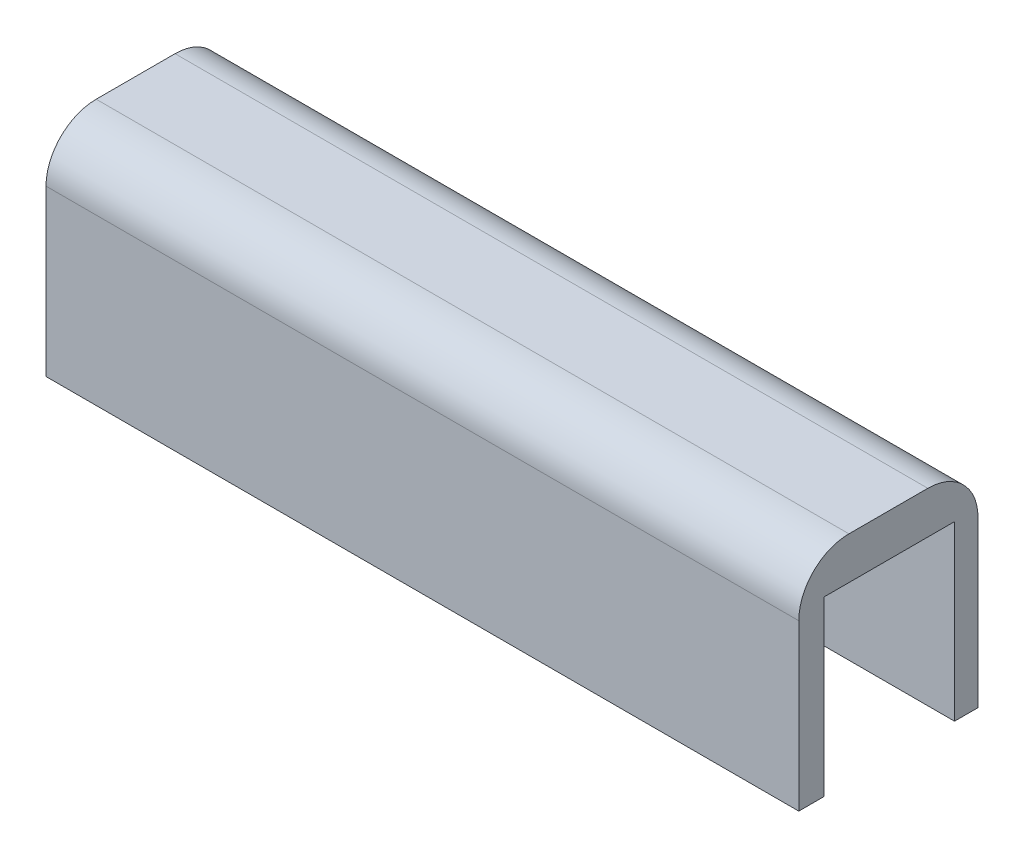
ISO-10303-21;
HEADER;
FILE_DESCRIPTION(('STEP AP214'),'2;1');
FILE_NAME('part.step','',(''),(''),'','','');
FILE_SCHEMA(('AUTOMOTIVE_DESIGN { 1 0 10303 214 1 1 1 1 }'));
ENDSEC;
DATA;
#1=APPLICATION_CONTEXT('core data for automotive mechanical design processes');
#2=APPLICATION_PROTOCOL_DEFINITION('international standard','automotive_design',2000,#1);
#3=PRODUCT_CONTEXT('',#1,'mechanical');
#4=PRODUCT('Part','Part','',(#3));
#5=PRODUCT_RELATED_PRODUCT_CATEGORY('part','',(#4));
#6=PRODUCT_DEFINITION_FORMATION('','',#4);
#7=PRODUCT_DEFINITION_CONTEXT('part definition',#1,'design');
#8=PRODUCT_DEFINITION('design','',#6,#7);
#9=PRODUCT_DEFINITION_SHAPE('','',#8);
#10=(LENGTH_UNIT() NAMED_UNIT(*) SI_UNIT(.MILLI.,.METRE.));
#11=(NAMED_UNIT(*) PLANE_ANGLE_UNIT() SI_UNIT($,.RADIAN.));
#12=(NAMED_UNIT(*) SI_UNIT($,.STERADIAN.) SOLID_ANGLE_UNIT());
#13=UNCERTAINTY_MEASURE_WITH_UNIT(LENGTH_MEASURE(1.E-05),#10,'distance_accuracy_value','');
#14=(GEOMETRIC_REPRESENTATION_CONTEXT(3) GLOBAL_UNCERTAINTY_ASSIGNED_CONTEXT((#13)) GLOBAL_UNIT_ASSIGNED_CONTEXT((#10,
#11,#12)) REPRESENTATION_CONTEXT('',''));
#15=CARTESIAN_POINT('',(0.,0.,0.));
#16=DIRECTION('',(0.,0.,1.));
#17=DIRECTION('',(1.,0.,0.));
#18=AXIS2_PLACEMENT_3D('',#15,#16,#17);
#19=CARTESIAN_POINT('',(52.5,-4.50726422184629,12.1306701866581));
#20=DIRECTION('',(0.,1.,0.));
#21=DIRECTION('',(0.,0.,1.));
#22=AXIS2_PLACEMENT_3D('',#19,#20,#21);
#23=PLANE('',#22);
#24=DIRECTION('',(0.,0.,-1.));
#25=VECTOR('',#24,1.);
#26=CARTESIAN_POINT('',(-52.5,-4.50726422184629,12.1306701866581));
#27=LINE('',#26,#25);
#28=CARTESIAN_POINT('',(-52.5,-4.50726422184629,15.6306701866581));
#29=VERTEX_POINT('',#28);
#30=CARTESIAN_POINT('',(-52.5,-4.50726422184629,12.1306701866581));
#31=VERTEX_POINT('',#30);
#32=EDGE_CURVE('E147',#29,#31,#27,.T.);
#33=ORIENTED_EDGE('',*,*,#32,.T.);
#34=DIRECTION('',(-1.,0.,0.));
#35=VECTOR('',#34,1.);
#36=CARTESIAN_POINT('',(52.5,-4.50726422184629,12.1306701866581));
#37=LINE('',#36,#35);
#38=CARTESIAN_POINT('',(52.5,-4.50726422184629,12.1306701866581));
#39=VERTEX_POINT('',#38);
#40=EDGE_CURVE('E128',#39,#31,#37,.T.);
#41=ORIENTED_EDGE('',*,*,#40,.F.);
#42=DIRECTION('',(0.,0.,-1.));
#43=VECTOR('',#42,1.);
#44=CARTESIAN_POINT('',(52.5,-4.50726422184629,12.1306701866581));
#45=LINE('',#44,#43);
#46=CARTESIAN_POINT('',(52.5,-4.50726422184629,15.6306701866581));
#47=VERTEX_POINT('',#46);
#48=EDGE_CURVE('E135',#47,#39,#45,.T.);
#49=ORIENTED_EDGE('',*,*,#48,.F.);
#50=DIRECTION('',(-1.,0.,0.));
#51=VECTOR('',#50,1.);
#52=CARTESIAN_POINT('',(52.5,-4.50726422184629,15.6306701866581));
#53=LINE('',#52,#51);
#54=EDGE_CURVE('E208',#47,#29,#53,.T.);
#55=ORIENTED_EDGE('',*,*,#54,.T.);
#56=EDGE_LOOP('',(#33,#41,#49,#55));
#57=FACE_BOUND('',#56,.T.);
#58=ADVANCED_FACE('F43',(#57),#23,.F.);
#59=CARTESIAN_POINT('',(52.5,19.604885310864,12.1306701866581));
#60=DIRECTION('',(0.,0.,1.));
#61=DIRECTION('',(0.,-1.,0.));
#62=AXIS2_PLACEMENT_3D('',#59,#60,#61);
#63=PLANE('',#62);
#64=DIRECTION('',(0.,1.,0.));
#65=VECTOR('',#64,1.);
#66=CARTESIAN_POINT('',(-52.5,19.604885310864,12.1306701866581));
#67=LINE('',#66,#65);
#68=CARTESIAN_POINT('',(-52.5,19.604885310864,12.1306701866581));
#69=VERTEX_POINT('',#68);
#70=EDGE_CURVE('E230',#31,#69,#67,.T.);
#71=ORIENTED_EDGE('',*,*,#70,.T.);
#72=DIRECTION('',(-1.,0.,0.));
#73=VECTOR('',#72,1.);
#74=CARTESIAN_POINT('',(52.5,19.604885310864,12.1306701866581));
#75=LINE('',#74,#73);
#76=CARTESIAN_POINT('',(52.5,19.604885310864,12.1306701866581));
#77=VERTEX_POINT('',#76);
#78=EDGE_CURVE('E131',#77,#69,#75,.T.);
#79=ORIENTED_EDGE('',*,*,#78,.F.);
#80=DIRECTION('',(0.,1.,0.));
#81=VECTOR('',#80,1.);
#82=CARTESIAN_POINT('',(52.5,19.604885310864,12.1306701866581));
#83=LINE('',#82,#81);
#84=EDGE_CURVE('E124',#39,#77,#83,.T.);
#85=ORIENTED_EDGE('',*,*,#84,.F.);
#86=ORIENTED_EDGE('',*,*,#40,.T.);
#87=EDGE_LOOP('',(#71,#79,#85,#86));
#88=FACE_BOUND('',#87,.T.);
#89=ADVANCED_FACE('F126',(#88),#63,.F.);
#90=CARTESIAN_POINT('',(52.5,19.604885310864,-6.09362887876241));
#91=DIRECTION('',(0.,1.,0.));
#92=DIRECTION('',(0.,0.,1.));
#93=AXIS2_PLACEMENT_3D('',#90,#91,#92);
#94=PLANE('',#93);
#95=DIRECTION('',(0.,0.,-1.));
#96=VECTOR('',#95,1.);
#97=CARTESIAN_POINT('',(-52.5,19.604885310864,-6.09362887876241));
#98=LINE('',#97,#96);
#99=CARTESIAN_POINT('',(-52.5,19.604885310864,-6.09362887876241));
#100=VERTEX_POINT('',#99);
#101=EDGE_CURVE('E227',#69,#100,#98,.T.);
#102=ORIENTED_EDGE('',*,*,#101,.T.);
#103=DIRECTION('',(-1.,0.,0.));
#104=VECTOR('',#103,1.);
#105=CARTESIAN_POINT('',(52.5,19.604885310864,-6.09362887876241));
#106=LINE('',#105,#104);
#107=CARTESIAN_POINT('',(52.5,19.604885310864,-6.09362887876241));
#108=VERTEX_POINT('',#107);
#109=EDGE_CURVE('E155',#108,#100,#106,.T.);
#110=ORIENTED_EDGE('',*,*,#109,.F.);
#111=DIRECTION('',(0.,0.,-1.));
#112=VECTOR('',#111,1.);
#113=CARTESIAN_POINT('',(52.5,19.604885310864,-6.09362887876241));
#114=LINE('',#113,#112);
#115=EDGE_CURVE('E134',#77,#108,#114,.T.);
#116=ORIENTED_EDGE('',*,*,#115,.F.);
#117=ORIENTED_EDGE('',*,*,#78,.T.);
#118=EDGE_LOOP('',(#102,#110,#116,#117));
#119=FACE_BOUND('',#118,.T.);
#120=ADVANCED_FACE('F247',(#119),#94,.F.);
#121=CARTESIAN_POINT('',(52.5,-4.50726422184628,-6.09362887876241));
#122=DIRECTION('',(0.,0.,-1.));
#123=DIRECTION('',(-1.,0.,0.));
#124=AXIS2_PLACEMENT_3D('',#121,#122,#123);
#125=PLANE('',#124);
#126=DIRECTION('',(0.,-1.,0.));
#127=VECTOR('',#126,1.);
#128=CARTESIAN_POINT('',(-52.5,-4.50726422184628,-6.09362887876241));
#129=LINE('',#128,#127);
#130=CARTESIAN_POINT('',(-52.5,-4.50726422184628,-6.09362887876241));
#131=VERTEX_POINT('',#130);
#132=EDGE_CURVE('E202',#100,#131,#129,.T.);
#133=ORIENTED_EDGE('',*,*,#132,.T.);
#134=DIRECTION('',(-1.,0.,0.));
#135=VECTOR('',#134,1.);
#136=CARTESIAN_POINT('',(52.5,-4.50726422184628,-6.09362887876241));
#137=LINE('',#136,#135);
#138=CARTESIAN_POINT('',(52.5,-4.50726422184628,-6.09362887876241));
#139=VERTEX_POINT('',#138);
#140=EDGE_CURVE('E213',#139,#131,#137,.T.);
#141=ORIENTED_EDGE('',*,*,#140,.F.);
#142=DIRECTION('',(0.,-1.,0.));
#143=VECTOR('',#142,1.);
#144=CARTESIAN_POINT('',(52.5,-4.50726422184628,-6.09362887876241));
#145=LINE('',#144,#143);
#146=EDGE_CURVE('E224',#108,#139,#145,.T.);
#147=ORIENTED_EDGE('',*,*,#146,.F.);
#148=ORIENTED_EDGE('',*,*,#109,.T.);
#149=EDGE_LOOP('',(#133,#141,#147,#148));
#150=FACE_BOUND('',#149,.T.);
#151=ADVANCED_FACE('F222',(#150),#125,.F.);
#152=CARTESIAN_POINT('',(52.5,-4.50726422184629,-9.36932981334186));
#153=DIRECTION('',(0.,1.,0.));
#154=DIRECTION('',(0.,0.,1.));
#155=AXIS2_PLACEMENT_3D('',#152,#153,#154);
#156=PLANE('',#155);
#157=DIRECTION('',(0.,0.,-1.));
#158=VECTOR('',#157,1.);
#159=CARTESIAN_POINT('',(-52.5,-4.50726422184629,-9.36932981334186));
#160=LINE('',#159,#158);
#161=CARTESIAN_POINT('',(-52.5,-4.50726422184629,-9.36932981334186));
#162=VERTEX_POINT('',#161);
#163=EDGE_CURVE('E197',#131,#162,#160,.T.);
#164=ORIENTED_EDGE('',*,*,#163,.T.);
#165=DIRECTION('',(-1.,0.,0.));
#166=VECTOR('',#165,1.);
#167=CARTESIAN_POINT('',(52.5,-4.50726422184629,-9.36932981334186));
#168=LINE('',#167,#166);
#169=CARTESIAN_POINT('',(52.5,-4.50726422184629,-9.36932981334186));
#170=VERTEX_POINT('',#169);
#171=EDGE_CURVE('E195',#170,#162,#168,.T.);
#172=ORIENTED_EDGE('',*,*,#171,.F.);
#173=DIRECTION('',(0.,0.,-1.));
#174=VECTOR('',#173,1.);
#175=CARTESIAN_POINT('',(52.5,-4.50726422184629,-9.36932981334186));
#176=LINE('',#175,#174);
#177=EDGE_CURVE('E241',#139,#170,#176,.T.);
#178=ORIENTED_EDGE('',*,*,#177,.F.);
#179=ORIENTED_EDGE('',*,*,#140,.T.);
#180=EDGE_LOOP('',(#164,#172,#178,#179));
#181=FACE_BOUND('',#180,.T.);
#182=ADVANCED_FACE('F254',(#181),#156,.F.);
#183=CARTESIAN_POINT('',(52.5,25.4927357781537,-9.36932981334185));
#184=DIRECTION('',(0.,0.,1.));
#185=DIRECTION('',(0.,-1.,0.));
#186=AXIS2_PLACEMENT_3D('',#183,#184,#185);
#187=PLANE('',#186);
#188=DIRECTION('',(0.,1.,0.));
#189=VECTOR('',#188,1.);
#190=CARTESIAN_POINT('',(-52.5,25.4927357781537,-9.36932981334185));
#191=LINE('',#190,#189);
#192=CARTESIAN_POINT('',(-52.5,18.4927357781537,-9.36932981334185));
#193=VERTEX_POINT('',#192);
#194=EDGE_CURVE('E190',#162,#193,#191,.T.);
#195=ORIENTED_EDGE('',*,*,#194,.T.);
#196=DIRECTION('',(-1.,0.,0.));
#197=VECTOR('',#196,1.);
#198=CARTESIAN_POINT('',(52.5,18.4927357781537,-9.36932981334185));
#199=LINE('',#198,#197);
#200=CARTESIAN_POINT('',(52.5,18.4927357781537,-9.36932981334185));
#201=VERTEX_POINT('',#200);
#202=EDGE_CURVE('E67',#193,#201,#199,.F.);
#203=ORIENTED_EDGE('',*,*,#202,.T.);
#204=DIRECTION('',(0.,1.,0.));
#205=VECTOR('',#204,1.);
#206=CARTESIAN_POINT('',(52.5,25.4927357781537,-9.36932981334185));
#207=LINE('',#206,#205);
#208=EDGE_CURVE('E175',#170,#201,#207,.T.);
#209=ORIENTED_EDGE('',*,*,#208,.F.);
#210=ORIENTED_EDGE('',*,*,#171,.T.);
#211=EDGE_LOOP('',(#195,#203,#209,#210));
#212=FACE_BOUND('',#211,.T.);
#213=ADVANCED_FACE('F193',(#212),#187,.F.);
#214=CARTESIAN_POINT('',(52.5,25.4927357781537,15.6306701866581));
#215=DIRECTION('',(0.,-1.,0.));
#216=DIRECTION('',(0.,0.,-1.));
#217=AXIS2_PLACEMENT_3D('',#214,#215,#216);
#218=PLANE('',#217);
#219=DIRECTION('',(0.,0.,1.));
#220=VECTOR('',#219,1.);
#221=CARTESIAN_POINT('',(52.5,25.4927357781537,15.6306701866581));
#222=LINE('',#221,#220);
#223=CARTESIAN_POINT('',(52.5,25.4927357781537,-2.36932981334186));
#224=VERTEX_POINT('',#223);
#225=CARTESIAN_POINT('',(52.5,25.4927357781537,8.63067018665815));
#226=VERTEX_POINT('',#225);
#227=EDGE_CURVE('E174',#224,#226,#222,.T.);
#228=ORIENTED_EDGE('',*,*,#227,.F.);
#229=DIRECTION('',(-1.,0.,0.));
#230=VECTOR('',#229,1.);
#231=CARTESIAN_POINT('',(52.5,25.4927357781537,-2.36932981334186));
#232=LINE('',#231,#230);
#233=CARTESIAN_POINT('',(-52.5,25.4927357781537,-2.36932981334186));
#234=VERTEX_POINT('',#233);
#235=EDGE_CURVE('E153',#224,#234,#232,.T.);
#236=ORIENTED_EDGE('',*,*,#235,.T.);
#237=DIRECTION('',(0.,0.,1.));
#238=VECTOR('',#237,1.);
#239=CARTESIAN_POINT('',(-52.5,25.4927357781537,15.6306701866581));
#240=LINE('',#239,#238);
#241=CARTESIAN_POINT('',(-52.5,25.4927357781537,8.63067018665815));
#242=VERTEX_POINT('',#241);
#243=EDGE_CURVE('E191',#234,#242,#240,.T.);
#244=ORIENTED_EDGE('',*,*,#243,.T.);
#245=DIRECTION('',(-1.,0.,0.));
#246=VECTOR('',#245,1.);
#247=CARTESIAN_POINT('',(52.5,25.4927357781537,8.63067018665815));
#248=LINE('',#247,#246);
#249=EDGE_CURVE('E149',#242,#226,#248,.F.);
#250=ORIENTED_EDGE('',*,*,#249,.T.);
#251=EDGE_LOOP('',(#228,#236,#244,#250));
#252=FACE_BOUND('',#251,.T.);
#253=ADVANCED_FACE('F179',(#252),#218,.F.);
#254=CARTESIAN_POINT('',(52.5,-4.50726422184629,15.6306701866581));
#255=DIRECTION('',(0.,0.,-1.));
#256=DIRECTION('',(-1.,0.,0.));
#257=AXIS2_PLACEMENT_3D('',#254,#255,#256);
#258=PLANE('',#257);
#259=DIRECTION('',(0.,-1.,0.));
#260=VECTOR('',#259,1.);
#261=CARTESIAN_POINT('',(52.5,-4.50726422184629,15.6306701866581));
#262=LINE('',#261,#260);
#263=CARTESIAN_POINT('',(52.5,18.4927357781537,15.6306701866581));
#264=VERTEX_POINT('',#263);
#265=EDGE_CURVE('E139',#264,#47,#262,.T.);
#266=ORIENTED_EDGE('',*,*,#265,.F.);
#267=DIRECTION('',(-1.,0.,0.));
#268=VECTOR('',#267,1.);
#269=CARTESIAN_POINT('',(52.5,18.4927357781537,15.6306701866581));
#270=LINE('',#269,#268);
#271=CARTESIAN_POINT('',(-52.5,18.4927357781537,15.6306701866581));
#272=VERTEX_POINT('',#271);
#273=EDGE_CURVE('E11',#264,#272,#270,.T.);
#274=ORIENTED_EDGE('',*,*,#273,.T.);
#275=DIRECTION('',(0.,-1.,0.));
#276=VECTOR('',#275,1.);
#277=CARTESIAN_POINT('',(-52.5,-4.50726422184629,15.6306701866581));
#278=LINE('',#277,#276);
#279=EDGE_CURVE('E144',#272,#29,#278,.T.);
#280=ORIENTED_EDGE('',*,*,#279,.T.);
#281=ORIENTED_EDGE('',*,*,#54,.F.);
#282=EDGE_LOOP('',(#266,#274,#280,#281));
#283=FACE_BOUND('',#282,.T.);
#284=ADVANCED_FACE('F271',(#283),#258,.F.);
#285=CARTESIAN_POINT('',(52.5,0.,0.));
#286=DIRECTION('',(-1.,0.,0.));
#287=DIRECTION('',(0.,0.,1.));
#288=AXIS2_PLACEMENT_3D('',#285,#286,#287);
#289=PLANE('',#288);
#290=ORIENTED_EDGE('',*,*,#208,.T.);
#291=CARTESIAN_POINT('',(52.5,18.4927357781537,-2.36932981334186));
#292=DIRECTION('',(-1.,0.,0.));
#293=DIRECTION('',(0.,0.,1.));
#294=AXIS2_PLACEMENT_3D('',#291,#292,#293);
#295=CIRCLE('',#294,7.);
#296=EDGE_CURVE('E52',#201,#224,#295,.F.);
#297=ORIENTED_EDGE('',*,*,#296,.T.);
#298=ORIENTED_EDGE('',*,*,#227,.T.);
#299=CARTESIAN_POINT('',(52.5,18.4927357781537,8.63067018665815));
#300=DIRECTION('',(-1.,0.,0.));
#301=DIRECTION('',(0.,0.,1.));
#302=AXIS2_PLACEMENT_3D('',#299,#300,#301);
#303=CIRCLE('',#302,7.);
#304=EDGE_CURVE('E59',#226,#264,#303,.F.);
#305=ORIENTED_EDGE('',*,*,#304,.T.);
#306=ORIENTED_EDGE('',*,*,#265,.T.);
#307=ORIENTED_EDGE('',*,*,#48,.T.);
#308=ORIENTED_EDGE('',*,*,#84,.T.);
#309=ORIENTED_EDGE('',*,*,#115,.T.);
#310=ORIENTED_EDGE('',*,*,#146,.T.);
#311=ORIENTED_EDGE('',*,*,#177,.T.);
#312=EDGE_LOOP('',(#290,#297,#298,#305,#306,#307,#308,#309,#310,#311));
#313=FACE_BOUND('',#312,.T.);
#314=ADVANCED_FACE('F138',(#313),#289,.F.);
#315=CARTESIAN_POINT('',(-52.5,0.,0.));
#316=DIRECTION('',(-1.,0.,0.));
#317=DIRECTION('',(0.,0.,1.));
#318=AXIS2_PLACEMENT_3D('',#315,#316,#317);
#319=PLANE('',#318);
#320=ORIENTED_EDGE('',*,*,#243,.F.);
#321=CARTESIAN_POINT('',(-52.5,18.4927357781537,-2.36932981334186));
#322=DIRECTION('',(-1.,0.,0.));
#323=DIRECTION('',(0.,0.,1.));
#324=AXIS2_PLACEMENT_3D('',#321,#322,#323);
#325=CIRCLE('',#324,7.);
#326=EDGE_CURVE('E165',#234,#193,#325,.T.);
#327=ORIENTED_EDGE('',*,*,#326,.T.);
#328=ORIENTED_EDGE('',*,*,#194,.F.);
#329=ORIENTED_EDGE('',*,*,#163,.F.);
#330=ORIENTED_EDGE('',*,*,#132,.F.);
#331=ORIENTED_EDGE('',*,*,#101,.F.);
#332=ORIENTED_EDGE('',*,*,#70,.F.);
#333=ORIENTED_EDGE('',*,*,#32,.F.);
#334=ORIENTED_EDGE('',*,*,#279,.F.);
#335=CARTESIAN_POINT('',(-52.5,18.4927357781537,8.63067018665815));
#336=DIRECTION('',(-1.,0.,0.));
#337=DIRECTION('',(0.,0.,1.));
#338=AXIS2_PLACEMENT_3D('',#335,#336,#337);
#339=CIRCLE('',#338,7.);
#340=EDGE_CURVE('E162',#272,#242,#339,.T.);
#341=ORIENTED_EDGE('',*,*,#340,.T.);
#342=EDGE_LOOP('',(#320,#327,#328,#329,#330,#331,#332,#333,#334,#341));
#343=FACE_BOUND('',#342,.T.);
#344=ADVANCED_FACE('F188',(#343),#319,.T.);
#345=CARTESIAN_POINT('',(52.5,18.4927357781537,-2.36932981334186));
#346=DIRECTION('',(-1.,0.,0.));
#347=DIRECTION('',(0.,0.,1.));
#348=AXIS2_PLACEMENT_3D('',#345,#346,#347);
#349=CYLINDRICAL_SURFACE('',#348,7.);
#350=ORIENTED_EDGE('',*,*,#296,.F.);
#351=ORIENTED_EDGE('',*,*,#202,.F.);
#352=ORIENTED_EDGE('',*,*,#326,.F.);
#353=ORIENTED_EDGE('',*,*,#235,.F.);
#354=EDGE_LOOP('',(#350,#351,#352,#353));
#355=FACE_BOUND('',#354,.T.);
#356=ADVANCED_FACE('F185',(#355),#349,.T.);
#357=CARTESIAN_POINT('',(52.5,18.4927357781537,8.63067018665815));
#358=DIRECTION('',(-1.,0.,0.));
#359=DIRECTION('',(0.,0.,1.));
#360=AXIS2_PLACEMENT_3D('',#357,#358,#359);
#361=CYLINDRICAL_SURFACE('',#360,7.);
#362=ORIENTED_EDGE('',*,*,#304,.F.);
#363=ORIENTED_EDGE('',*,*,#249,.F.);
#364=ORIENTED_EDGE('',*,*,#340,.F.);
#365=ORIENTED_EDGE('',*,*,#273,.F.);
#366=EDGE_LOOP('',(#362,#363,#364,#365));
#367=FACE_BOUND('',#366,.T.);
#368=ADVANCED_FACE('F45',(#367),#361,.T.);
#369=CLOSED_SHELL('',(#58,#89,#120,#151,#182,#213,#253,#284,#314,#344,#356,#368));
#370=MANIFOLD_SOLID_BREP('B2',#369);
#371=ADVANCED_BREP_SHAPE_REPRESENTATION('',(#18,#370),#14);
#372=SHAPE_DEFINITION_REPRESENTATION(#9,#371);
ENDSEC;
END-ISO-10303-21;
